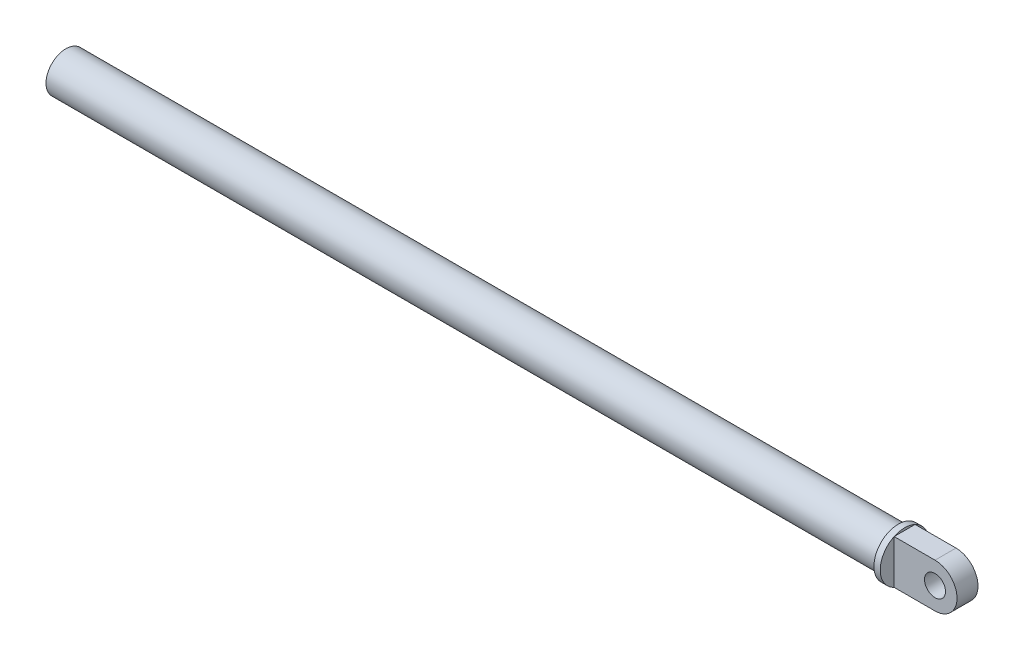
ISO-10303-21;
HEADER;
FILE_DESCRIPTION(('STEP AP214'),'2;1');
FILE_NAME('part.step','',(''),(''),'','','');
FILE_SCHEMA(('AUTOMOTIVE_DESIGN { 1 0 10303 214 1 1 1 1 }'));
ENDSEC;
DATA;
#1=APPLICATION_CONTEXT('core data for automotive mechanical design processes');
#2=APPLICATION_PROTOCOL_DEFINITION('international standard','automotive_design',2000,#1);
#3=PRODUCT_CONTEXT('',#1,'mechanical');
#4=PRODUCT('Part','Part','',(#3));
#5=PRODUCT_RELATED_PRODUCT_CATEGORY('part','',(#4));
#6=PRODUCT_DEFINITION_FORMATION('','',#4);
#7=PRODUCT_DEFINITION_CONTEXT('part definition',#1,'design');
#8=PRODUCT_DEFINITION('design','',#6,#7);
#9=PRODUCT_DEFINITION_SHAPE('','',#8);
#10=(LENGTH_UNIT() NAMED_UNIT(*) SI_UNIT(.MILLI.,.METRE.));
#11=(NAMED_UNIT(*) PLANE_ANGLE_UNIT() SI_UNIT($,.RADIAN.));
#12=(NAMED_UNIT(*) SI_UNIT($,.STERADIAN.) SOLID_ANGLE_UNIT());
#13=UNCERTAINTY_MEASURE_WITH_UNIT(LENGTH_MEASURE(1.E-05),#10,'distance_accuracy_value','');
#14=(GEOMETRIC_REPRESENTATION_CONTEXT(3) GLOBAL_UNCERTAINTY_ASSIGNED_CONTEXT((#13)) GLOBAL_UNIT_ASSIGNED_CONTEXT((#10,
#11,#12)) REPRESENTATION_CONTEXT('',''));
#15=CARTESIAN_POINT('',(0.,0.,0.));
#16=DIRECTION('',(0.,0.,1.));
#17=DIRECTION('',(1.,0.,0.));
#18=AXIS2_PLACEMENT_3D('',#15,#16,#17);
#19=CARTESIAN_POINT('',(-31.3637873754153,3.65282392026578,10.));
#20=DIRECTION('',(0.,0.,-1.));
#21=DIRECTION('',(-1.,0.,0.));
#22=AXIS2_PLACEMENT_3D('',#19,#20,#21);
#23=CYLINDRICAL_SURFACE('',#22,10.5);
#24=CARTESIAN_POINT('',(-31.3637873754153,3.65282392026578,0.));
#25=DIRECTION('',(0.,0.,1.));
#26=DIRECTION('',(1.,0.,0.));
#27=AXIS2_PLACEMENT_3D('',#24,#25,#26);
#28=CIRCLE('',#27,10.5);
#29=CARTESIAN_POINT('',(-31.3637873754153,-6.84717607973422,0.));
#30=VERTEX_POINT('',#29);
#31=CARTESIAN_POINT('',(-31.3637873754153,14.1528239202658,0.));
#32=VERTEX_POINT('',#31);
#33=EDGE_CURVE('E100',#30,#32,#28,.T.);
#34=ORIENTED_EDGE('',*,*,#33,.T.);
#35=DIRECTION('',(0.,0.,-1.));
#36=VECTOR('',#35,1.);
#37=CARTESIAN_POINT('',(-31.3637873754153,14.1528239202658,10.));
#38=LINE('',#37,#36);
#39=CARTESIAN_POINT('',(-31.3637873754153,14.1528239202658,10.));
#40=VERTEX_POINT('',#39);
#41=EDGE_CURVE('E52',#40,#32,#38,.T.);
#42=ORIENTED_EDGE('',*,*,#41,.F.);
#43=CARTESIAN_POINT('',(-31.3637873754153,3.65282392026578,10.));
#44=DIRECTION('',(0.,0.,1.));
#45=DIRECTION('',(1.,0.,0.));
#46=AXIS2_PLACEMENT_3D('',#43,#44,#45);
#47=CIRCLE('',#46,10.5);
#48=CARTESIAN_POINT('',(-31.3637873754153,-6.84717607973422,10.));
#49=VERTEX_POINT('',#48);
#50=EDGE_CURVE('E85',#49,#40,#47,.T.);
#51=ORIENTED_EDGE('',*,*,#50,.F.);
#52=DIRECTION('',(0.,0.,-1.));
#53=VECTOR('',#52,1.);
#54=CARTESIAN_POINT('',(-31.3637873754153,-6.84717607973422,10.));
#55=LINE('',#54,#53);
#56=EDGE_CURVE('E139',#49,#30,#55,.T.);
#57=ORIENTED_EDGE('',*,*,#56,.T.);
#58=EDGE_LOOP('',(#34,#42,#51,#57));
#59=FACE_BOUND('',#58,.T.);
#60=ADVANCED_FACE('F43',(#59),#23,.T.);
#61=CARTESIAN_POINT('',(0.,14.1528239202658,10.));
#62=DIRECTION('',(0.,1.,0.));
#63=DIRECTION('',(0.,0.,1.));
#64=AXIS2_PLACEMENT_3D('',#61,#62,#63);
#65=PLANE('',#64);
#66=DIRECTION('',(1.,0.,0.));
#67=VECTOR('',#66,1.);
#68=CARTESIAN_POINT('',(0.,14.1528239202658,0.));
#69=LINE('',#68,#67);
#70=CARTESIAN_POINT('',(-50.8637873754153,14.1528239202658,0.));
#71=VERTEX_POINT('',#70);
#72=EDGE_CURVE('E92',#71,#32,#69,.T.);
#73=ORIENTED_EDGE('',*,*,#72,.F.);
#74=DIRECTION('',(0.,0.,-1.));
#75=VECTOR('',#74,1.);
#76=CARTESIAN_POINT('',(-50.8637873754153,14.1528239202658,10.));
#77=LINE('',#76,#75);
#78=CARTESIAN_POINT('',(-50.8637873754153,14.1528239202658,10.));
#79=VERTEX_POINT('',#78);
#80=EDGE_CURVE('E96',#79,#71,#77,.T.);
#81=ORIENTED_EDGE('',*,*,#80,.F.);
#82=DIRECTION('',(1.,0.,0.));
#83=VECTOR('',#82,1.);
#84=CARTESIAN_POINT('',(0.,14.1528239202658,10.));
#85=LINE('',#84,#83);
#86=EDGE_CURVE('E149',#79,#40,#85,.T.);
#87=ORIENTED_EDGE('',*,*,#86,.T.);
#88=ORIENTED_EDGE('',*,*,#41,.T.);
#89=EDGE_LOOP('',(#73,#81,#87,#88));
#90=FACE_BOUND('',#89,.T.);
#91=ADVANCED_FACE('F93',(#90),#65,.T.);
#92=CARTESIAN_POINT('',(-31.3637873754153,3.65282392026578,10.));
#93=DIRECTION('',(0.,0.,-1.));
#94=DIRECTION('',(-1.,0.,0.));
#95=AXIS2_PLACEMENT_3D('',#92,#93,#94);
#96=CYLINDRICAL_SURFACE('',#95,5.);
#97=CARTESIAN_POINT('',(-31.3637873754153,3.65282392026578,10.));
#98=DIRECTION('',(0.,0.,1.));
#99=DIRECTION('',(1.,0.,0.));
#100=AXIS2_PLACEMENT_3D('',#97,#98,#99);
#101=CIRCLE('',#100,5.);
#102=CARTESIAN_POINT('',(-26.3637873754153,3.65282392026578,10.));
#103=VERTEX_POINT('',#102);
#104=EDGE_CURVE('E141',#103,#103,#101,.T.);
#105=ORIENTED_EDGE('',*,*,#104,.T.);
#106=EDGE_LOOP('',(#105));
#107=FACE_BOUND('',#106,.T.);
#108=CARTESIAN_POINT('',(-31.3637873754153,3.65282392026578,0.));
#109=DIRECTION('',(0.,0.,1.));
#110=DIRECTION('',(1.,0.,0.));
#111=AXIS2_PLACEMENT_3D('',#108,#109,#110);
#112=CIRCLE('',#111,5.);
#113=CARTESIAN_POINT('',(-26.3637873754153,3.65282392026578,0.));
#114=VERTEX_POINT('',#113);
#115=EDGE_CURVE('E125',#114,#114,#112,.T.);
#116=ORIENTED_EDGE('',*,*,#115,.F.);
#117=EDGE_LOOP('',(#116));
#118=FACE_BOUND('',#117,.T.);
#119=ADVANCED_FACE('F45',(#107,#118),#96,.F.);
#120=CARTESIAN_POINT('',(0.,-6.84717607973422,10.));
#121=DIRECTION('',(0.,1.,0.));
#122=DIRECTION('',(0.,0.,1.));
#123=AXIS2_PLACEMENT_3D('',#120,#121,#122);
#124=PLANE('',#123);
#125=DIRECTION('',(1.,0.,0.));
#126=VECTOR('',#125,1.);
#127=CARTESIAN_POINT('',(0.,-6.84717607973422,0.));
#128=LINE('',#127,#126);
#129=CARTESIAN_POINT('',(-50.8637873754153,-6.84717607973422,0.));
#130=VERTEX_POINT('',#129);
#131=EDGE_CURVE('E80',#130,#30,#128,.T.);
#132=ORIENTED_EDGE('',*,*,#131,.T.);
#133=ORIENTED_EDGE('',*,*,#56,.F.);
#134=DIRECTION('',(1.,0.,0.));
#135=VECTOR('',#134,1.);
#136=CARTESIAN_POINT('',(0.,-6.84717607973422,10.));
#137=LINE('',#136,#135);
#138=CARTESIAN_POINT('',(-50.8637873754153,-6.84717607973422,10.));
#139=VERTEX_POINT('',#138);
#140=EDGE_CURVE('E60',#139,#49,#137,.T.);
#141=ORIENTED_EDGE('',*,*,#140,.F.);
#142=DIRECTION('',(0.,0.,-1.));
#143=VECTOR('',#142,1.);
#144=CARTESIAN_POINT('',(-50.8637873754153,-6.84717607973422,10.));
#145=LINE('',#144,#143);
#146=EDGE_CURVE('E110',#139,#130,#145,.T.);
#147=ORIENTED_EDGE('',*,*,#146,.T.);
#148=EDGE_LOOP('',(#132,#133,#141,#147));
#149=FACE_BOUND('',#148,.T.);
#150=ADVANCED_FACE('F158',(#149),#124,.F.);
#151=CARTESIAN_POINT('',(0.,0.,10.));
#152=DIRECTION('',(0.,0.,1.));
#153=DIRECTION('',(1.,0.,0.));
#154=AXIS2_PLACEMENT_3D('',#151,#152,#153);
#155=PLANE('',#154);
#156=ORIENTED_EDGE('',*,*,#104,.F.);
#157=EDGE_LOOP('',(#156));
#158=FACE_BOUND('',#157,.T.);
#159=ORIENTED_EDGE('',*,*,#50,.T.);
#160=ORIENTED_EDGE('',*,*,#86,.F.);
#161=DIRECTION('',(0.,-1.,0.));
#162=VECTOR('',#161,1.);
#163=CARTESIAN_POINT('',(-50.8637873754153,0.,10.));
#164=LINE('',#163,#162);
#165=EDGE_CURVE('E147',#79,#139,#164,.T.);
#166=ORIENTED_EDGE('',*,*,#165,.T.);
#167=ORIENTED_EDGE('',*,*,#140,.T.);
#168=EDGE_LOOP('',(#159,#160,#166,#167));
#169=FACE_BOUND('',#168,.T.);
#170=ADVANCED_FACE('F156',(#158,#169),#155,.T.);
#171=CARTESIAN_POINT('',(0.,0.,0.));
#172=DIRECTION('',(0.,0.,1.));
#173=DIRECTION('',(1.,0.,0.));
#174=AXIS2_PLACEMENT_3D('',#171,#172,#173);
#175=PLANE('',#174);
#176=ORIENTED_EDGE('',*,*,#115,.T.);
#177=EDGE_LOOP('',(#176));
#178=FACE_BOUND('',#177,.T.);
#179=ORIENTED_EDGE('',*,*,#33,.F.);
#180=ORIENTED_EDGE('',*,*,#131,.F.);
#181=DIRECTION('',(0.,-1.,0.));
#182=VECTOR('',#181,1.);
#183=CARTESIAN_POINT('',(-50.8637873754153,0.,0.));
#184=LINE('',#183,#182);
#185=EDGE_CURVE('E74',#71,#130,#184,.T.);
#186=ORIENTED_EDGE('',*,*,#185,.F.);
#187=ORIENTED_EDGE('',*,*,#72,.T.);
#188=EDGE_LOOP('',(#179,#180,#186,#187));
#189=FACE_BOUND('',#188,.T.);
#190=ADVANCED_FACE('F102',(#178,#189),#175,.F.);
#191=CARTESIAN_POINT('',(-50.8637873754153,0.,0.));
#192=DIRECTION('',(-1.,0.,0.));
#193=DIRECTION('',(0.,0.,1.));
#194=AXIS2_PLACEMENT_3D('',#191,#192,#193);
#195=PLANE('',#194);
#196=ORIENTED_EDGE('',*,*,#146,.F.);
#197=CARTESIAN_POINT('',(-50.8637873754153,3.65282392026578,5.));
#198=DIRECTION('',(-1.,0.,0.));
#199=DIRECTION('',(0.,0.,1.));
#200=AXIS2_PLACEMENT_3D('',#197,#198,#199);
#201=CIRCLE('',#200,11.629703349613);
#202=EDGE_CURVE('E117',#130,#139,#201,.T.);
#203=ORIENTED_EDGE('',*,*,#202,.F.);
#204=EDGE_LOOP('',(#196,#203));
#205=FACE_BOUND('',#204,.T.);
#206=ADVANCED_FACE('F164',(#205),#195,.F.);
#207=EDGE_CURVE('E122',#139,#79,#201,.T.);
#208=ORIENTED_EDGE('',*,*,#207,.F.);
#209=ORIENTED_EDGE('',*,*,#165,.F.);
#210=EDGE_LOOP('',(#208,#209));
#211=FACE_BOUND('',#210,.T.);
#212=ADVANCED_FACE('F181',(#211),#195,.F.);
#213=ORIENTED_EDGE('',*,*,#185,.T.);
#214=EDGE_CURVE('E113',#71,#130,#201,.T.);
#215=ORIENTED_EDGE('',*,*,#214,.F.);
#216=EDGE_LOOP('',(#213,#215));
#217=FACE_BOUND('',#216,.T.);
#218=ADVANCED_FACE('F114',(#217),#195,.F.);
#219=CARTESIAN_POINT('',(-53.8637873754153,3.65282392026578,5.));
#220=DIRECTION('',(1.,0.,0.));
#221=DIRECTION('',(0.,0.,-1.));
#222=AXIS2_PLACEMENT_3D('',#219,#220,#221);
#223=CYLINDRICAL_SURFACE('',#222,11.629703349613);
#224=CARTESIAN_POINT('',(-53.8637873754153,3.65282392026578,5.));
#225=DIRECTION('',(-1.,0.,0.));
#226=DIRECTION('',(0.,0.,1.));
#227=AXIS2_PLACEMENT_3D('',#224,#225,#226);
#228=CIRCLE('',#227,11.629703349613);
#229=CARTESIAN_POINT('',(-53.8637873754153,3.65282392026578,16.629703349613));
#230=VERTEX_POINT('',#229);
#231=EDGE_CURVE('E123',#230,#230,#228,.T.);
#232=ORIENTED_EDGE('',*,*,#231,.F.);
#233=EDGE_LOOP('',(#232));
#234=FACE_BOUND('',#233,.T.);
#235=EDGE_CURVE('E109',#79,#71,#201,.T.);
#236=ORIENTED_EDGE('',*,*,#235,.T.);
#237=ORIENTED_EDGE('',*,*,#214,.T.);
#238=ORIENTED_EDGE('',*,*,#202,.T.);
#239=ORIENTED_EDGE('',*,*,#207,.T.);
#240=EDGE_LOOP('',(#236,#237,#238,#239));
#241=FACE_BOUND('',#240,.T.);
#242=ADVANCED_FACE('F120',(#234,#241),#223,.T.);
#243=CARTESIAN_POINT('',(-53.8637873754153,0.,0.));
#244=DIRECTION('',(-1.,0.,0.));
#245=DIRECTION('',(0.,0.,1.));
#246=AXIS2_PLACEMENT_3D('',#243,#244,#245);
#247=PLANE('',#246);
#248=CARTESIAN_POINT('',(-53.8637873754153,3.65282392026578,5.));
#249=DIRECTION('',(-1.,0.,0.));
#250=DIRECTION('',(0.,0.,1.));
#251=AXIS2_PLACEMENT_3D('',#248,#249,#250);
#252=CIRCLE('',#251,9.5);
#253=CARTESIAN_POINT('',(-53.8637873754153,3.65282392026578,14.5));
#254=VERTEX_POINT('',#253);
#255=EDGE_CURVE('E128',#254,#254,#252,.F.);
#256=ORIENTED_EDGE('',*,*,#255,.T.);
#257=EDGE_LOOP('',(#256));
#258=FACE_BOUND('',#257,.T.);
#259=ORIENTED_EDGE('',*,*,#231,.T.);
#260=EDGE_LOOP('',(#259));
#261=FACE_BOUND('',#260,.T.);
#262=ADVANCED_FACE('F190',(#258,#261),#247,.T.);
#263=ORIENTED_EDGE('',*,*,#235,.F.);
#264=ORIENTED_EDGE('',*,*,#80,.T.);
#265=EDGE_LOOP('',(#263,#264));
#266=FACE_BOUND('',#265,.T.);
#267=ADVANCED_FACE('F107',(#266),#195,.F.);
#268=CARTESIAN_POINT('',(-450.863787375415,3.65282392026578,5.));
#269=DIRECTION('',(1.,0.,0.));
#270=DIRECTION('',(0.,0.,-1.));
#271=AXIS2_PLACEMENT_3D('',#268,#269,#270);
#272=CYLINDRICAL_SURFACE('',#271,8.);
#273=CARTESIAN_POINT('',(-53.8637873754153,3.65282392026578,5.));
#274=DIRECTION('',(-1.,0.,0.));
#275=DIRECTION('',(0.,0.,1.));
#276=AXIS2_PLACEMENT_3D('',#273,#274,#275);
#277=CIRCLE('',#276,8.);
#278=CARTESIAN_POINT('',(-53.8637873754153,3.65282392026578,13.));
#279=VERTEX_POINT('',#278);
#280=EDGE_CURVE('E11',#279,#279,#277,.F.);
#281=ORIENTED_EDGE('',*,*,#280,.T.);
#282=EDGE_LOOP('',(#281));
#283=FACE_BOUND('',#282,.T.);
#284=CARTESIAN_POINT('',(-450.863787375415,3.65282392026578,5.));
#285=DIRECTION('',(-1.,0.,0.));
#286=DIRECTION('',(0.,0.,1.));
#287=AXIS2_PLACEMENT_3D('',#284,#285,#286);
#288=CIRCLE('',#287,8.);
#289=CARTESIAN_POINT('',(-450.863787375415,3.65282392026578,13.));
#290=VERTEX_POINT('',#289);
#291=EDGE_CURVE('E134',#290,#290,#288,.T.);
#292=ORIENTED_EDGE('',*,*,#291,.T.);
#293=EDGE_LOOP('',(#292));
#294=FACE_BOUND('',#293,.T.);
#295=ADVANCED_FACE('F189',(#283,#294),#272,.F.);
#296=CARTESIAN_POINT('',(-450.863787375415,3.65282392026578,5.));
#297=DIRECTION('',(1.,0.,0.));
#298=DIRECTION('',(0.,0.,-1.));
#299=AXIS2_PLACEMENT_3D('',#296,#297,#298);
#300=CYLINDRICAL_SURFACE('',#299,9.5);
#301=ORIENTED_EDGE('',*,*,#255,.F.);
#302=EDGE_LOOP('',(#301));
#303=FACE_BOUND('',#302,.T.);
#304=CARTESIAN_POINT('',(-450.863787375415,3.65282392026578,5.));
#305=DIRECTION('',(-1.,0.,0.));
#306=DIRECTION('',(0.,0.,1.));
#307=AXIS2_PLACEMENT_3D('',#304,#305,#306);
#308=CIRCLE('',#307,9.5);
#309=CARTESIAN_POINT('',(-450.863787375415,3.65282392026578,14.5));
#310=VERTEX_POINT('',#309);
#311=EDGE_CURVE('E130',#310,#310,#308,.T.);
#312=ORIENTED_EDGE('',*,*,#311,.F.);
#313=EDGE_LOOP('',(#312));
#314=FACE_BOUND('',#313,.T.);
#315=ADVANCED_FACE('F209',(#303,#314),#300,.T.);
#316=CARTESIAN_POINT('',(-450.863787375415,0.,0.));
#317=DIRECTION('',(-1.,0.,0.));
#318=DIRECTION('',(0.,0.,1.));
#319=AXIS2_PLACEMENT_3D('',#316,#317,#318);
#320=PLANE('',#319);
#321=ORIENTED_EDGE('',*,*,#291,.F.);
#322=EDGE_LOOP('',(#321));
#323=FACE_BOUND('',#322,.T.);
#324=ORIENTED_EDGE('',*,*,#311,.T.);
#325=EDGE_LOOP('',(#324));
#326=FACE_BOUND('',#325,.T.);
#327=ADVANCED_FACE('F204',(#323,#326),#320,.T.);
#328=ORIENTED_EDGE('',*,*,#280,.F.);
#329=EDGE_LOOP('',(#328));
#330=FACE_BOUND('',#329,.T.);
#331=ADVANCED_FACE('F197',(#330),#247,.T.);
#332=CLOSED_SHELL('',(#60,#91,#119,#150,#170,#190,#206,#212,#218,#242,#262,#267,#295,#315,#327,#331));
#333=MANIFOLD_SOLID_BREP('B2',#332);
#334=ADVANCED_BREP_SHAPE_REPRESENTATION('',(#18,#333),#14);
#335=SHAPE_DEFINITION_REPRESENTATION(#9,#334);
ENDSEC;
END-ISO-10303-21;
